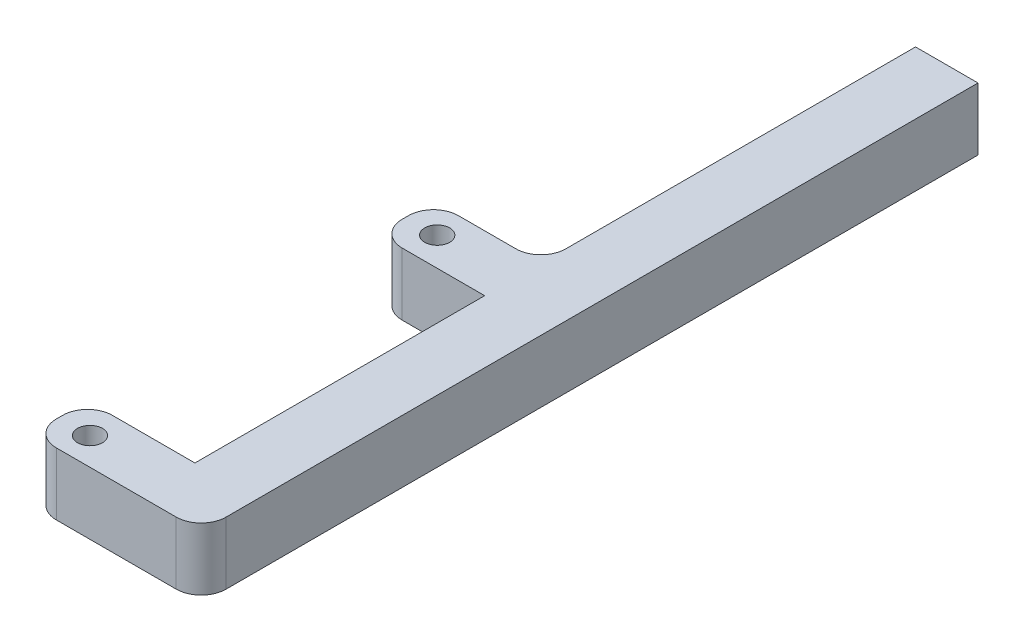
ISO-10303-21;
HEADER;
FILE_DESCRIPTION(('STEP AP214'),'2;1');
FILE_NAME('part.step','',(''),(''),'','','');
FILE_SCHEMA(('AUTOMOTIVE_DESIGN { 1 0 10303 214 1 1 1 1 }'));
ENDSEC;
DATA;
#1=APPLICATION_CONTEXT('core data for automotive mechanical design processes');
#2=APPLICATION_PROTOCOL_DEFINITION('international standard','automotive_design',2000,#1);
#3=PRODUCT_CONTEXT('',#1,'mechanical');
#4=PRODUCT('Part','Part','',(#3));
#5=PRODUCT_RELATED_PRODUCT_CATEGORY('part','',(#4));
#6=PRODUCT_DEFINITION_FORMATION('','',#4);
#7=PRODUCT_DEFINITION_CONTEXT('part definition',#1,'design');
#8=PRODUCT_DEFINITION('design','',#6,#7);
#9=PRODUCT_DEFINITION_SHAPE('','',#8);
#10=(LENGTH_UNIT() NAMED_UNIT(*) SI_UNIT(.MILLI.,.METRE.));
#11=(NAMED_UNIT(*) PLANE_ANGLE_UNIT() SI_UNIT($,.RADIAN.));
#12=(NAMED_UNIT(*) SI_UNIT($,.STERADIAN.) SOLID_ANGLE_UNIT());
#13=UNCERTAINTY_MEASURE_WITH_UNIT(LENGTH_MEASURE(1.E-05),#10,'distance_accuracy_value','');
#14=(GEOMETRIC_REPRESENTATION_CONTEXT(3) GLOBAL_UNCERTAINTY_ASSIGNED_CONTEXT((#13)) GLOBAL_UNIT_ASSIGNED_CONTEXT((#10,
#11,#12)) REPRESENTATION_CONTEXT('',''));
#15=CARTESIAN_POINT('',(0.,0.,0.));
#16=DIRECTION('',(0.,0.,1.));
#17=DIRECTION('',(1.,0.,0.));
#18=AXIS2_PLACEMENT_3D('',#15,#16,#17);
#19=CARTESIAN_POINT('',(0.,5.,0.));
#20=DIRECTION('',(0.,-1.,0.));
#21=DIRECTION('',(0.,0.,-1.));
#22=AXIS2_PLACEMENT_3D('',#19,#20,#21);
#23=PLANE('',#22);
#24=DIRECTION('',(-1.,0.,0.));
#25=VECTOR('',#24,1.);
#26=CARTESIAN_POINT('',(0.,5.,-4.5));
#27=LINE('',#26,#25);
#28=CARTESIAN_POINT('',(8.6,5.,-4.5));
#29=VERTEX_POINT('',#28);
#30=CARTESIAN_POINT('',(2.,5.,-4.5));
#31=VERTEX_POINT('',#30);
#32=EDGE_CURVE('E203',#29,#31,#27,.T.);
#33=ORIENTED_EDGE('',*,*,#32,.T.);
#34=CARTESIAN_POINT('',(2.,5.,-2.5));
#35=DIRECTION('',(0.,-1.,0.));
#36=DIRECTION('',(0.,0.,-1.));
#37=AXIS2_PLACEMENT_3D('',#34,#35,#36);
#38=CIRCLE('',#37,2.);
#39=CARTESIAN_POINT('',(0.,5.,-2.5));
#40=VERTEX_POINT('',#39);
#41=EDGE_CURVE('E286',#31,#40,#38,.F.);
#42=ORIENTED_EDGE('',*,*,#41,.T.);
#43=DIRECTION('',(0.,0.,1.));
#44=VECTOR('',#43,1.);
#45=CARTESIAN_POINT('',(0.,5.,0.));
#46=LINE('',#45,#44);
#47=CARTESIAN_POINT('',(0.,5.,-2.));
#48=VERTEX_POINT('',#47);
#49=EDGE_CURVE('E242',#40,#48,#46,.T.);
#50=ORIENTED_EDGE('',*,*,#49,.T.);
#51=CARTESIAN_POINT('',(2.,5.,-2.));
#52=DIRECTION('',(0.,-1.,0.));
#53=DIRECTION('',(0.,0.,-1.));
#54=AXIS2_PLACEMENT_3D('',#51,#52,#53);
#55=CIRCLE('',#54,2.);
#56=CARTESIAN_POINT('',(2.,5.,0.));
#57=VERTEX_POINT('',#56);
#58=EDGE_CURVE('E281',#48,#57,#55,.F.);
#59=ORIENTED_EDGE('',*,*,#58,.T.);
#60=DIRECTION('',(1.,0.,0.));
#61=VECTOR('',#60,1.);
#62=CARTESIAN_POINT('',(0.,5.,0.));
#63=LINE('',#62,#61);
#64=CARTESIAN_POINT('',(11.6,5.,0.));
#65=VERTEX_POINT('',#64);
#66=EDGE_CURVE('E167',#57,#65,#63,.T.);
#67=ORIENTED_EDGE('',*,*,#66,.T.);
#68=CARTESIAN_POINT('',(11.6,5.,-2.));
#69=DIRECTION('',(0.,-1.,0.));
#70=DIRECTION('',(0.,0.,-1.));
#71=AXIS2_PLACEMENT_3D('',#68,#69,#70);
#72=CIRCLE('',#71,2.);
#73=CARTESIAN_POINT('',(13.6,5.,-2.));
#74=VERTEX_POINT('',#73);
#75=EDGE_CURVE('E162',#65,#74,#72,.F.);
#76=ORIENTED_EDGE('',*,*,#75,.T.);
#77=DIRECTION('',(0.,0.,-1.));
#78=VECTOR('',#77,1.);
#79=CARTESIAN_POINT('',(13.6,5.,0.));
#80=LINE('',#79,#78);
#81=CARTESIAN_POINT('',(13.6,5.,-62.2));
#82=VERTEX_POINT('',#81);
#83=EDGE_CURVE('E152',#74,#82,#80,.T.);
#84=ORIENTED_EDGE('',*,*,#83,.T.);
#85=DIRECTION('',(-1.,0.,0.));
#86=VECTOR('',#85,1.);
#87=CARTESIAN_POINT('',(8.6,5.,-62.2));
#88=LINE('',#87,#86);
#89=CARTESIAN_POINT('',(8.6,5.,-62.2));
#90=VERTEX_POINT('',#89);
#91=EDGE_CURVE('E158',#82,#90,#88,.T.);
#92=ORIENTED_EDGE('',*,*,#91,.T.);
#93=DIRECTION('',(0.,0.,1.));
#94=VECTOR('',#93,1.);
#95=CARTESIAN_POINT('',(8.6,5.,-32.2));
#96=LINE('',#95,#94);
#97=CARTESIAN_POINT('',(8.6,5.,-34.2));
#98=VERTEX_POINT('',#97);
#99=EDGE_CURVE('E184',#90,#98,#96,.T.);
#100=ORIENTED_EDGE('',*,*,#99,.T.);
#101=CARTESIAN_POINT('',(6.6,5.,-34.2));
#102=DIRECTION('',(0.,-1.,0.));
#103=DIRECTION('',(0.,0.,-1.));
#104=AXIS2_PLACEMENT_3D('',#101,#102,#103);
#105=CIRCLE('',#104,2.);
#106=CARTESIAN_POINT('',(6.6,5.,-32.2));
#107=VERTEX_POINT('',#106);
#108=EDGE_CURVE('E11',#98,#107,#105,.T.);
#109=ORIENTED_EDGE('',*,*,#108,.T.);
#110=DIRECTION('',(-1.,0.,0.));
#111=VECTOR('',#110,1.);
#112=CARTESIAN_POINT('',(0.,5.,-32.2));
#113=LINE('',#112,#111);
#114=CARTESIAN_POINT('',(2.,5.,-32.2));
#115=VERTEX_POINT('',#114);
#116=EDGE_CURVE('E187',#107,#115,#113,.T.);
#117=ORIENTED_EDGE('',*,*,#116,.T.);
#118=CARTESIAN_POINT('',(2.,5.,-30.2));
#119=DIRECTION('',(0.,-1.,0.));
#120=DIRECTION('',(0.,0.,-1.));
#121=AXIS2_PLACEMENT_3D('',#118,#119,#120);
#122=CIRCLE('',#121,2.);
#123=CARTESIAN_POINT('',(0.,5.,-30.2));
#124=VERTEX_POINT('',#123);
#125=EDGE_CURVE('E278',#115,#124,#122,.F.);
#126=ORIENTED_EDGE('',*,*,#125,.T.);
#127=DIRECTION('',(0.,0.,1.));
#128=VECTOR('',#127,1.);
#129=CARTESIAN_POINT('',(0.,5.,-27.7));
#130=LINE('',#129,#128);
#131=CARTESIAN_POINT('',(0.,5.,-29.7));
#132=VERTEX_POINT('',#131);
#133=EDGE_CURVE('E194',#124,#132,#130,.T.);
#134=ORIENTED_EDGE('',*,*,#133,.T.);
#135=CARTESIAN_POINT('',(2.,5.,-29.7));
#136=DIRECTION('',(0.,-1.,0.));
#137=DIRECTION('',(0.,0.,-1.));
#138=AXIS2_PLACEMENT_3D('',#135,#136,#137);
#139=CIRCLE('',#138,2.);
#140=CARTESIAN_POINT('',(2.,5.,-27.7));
#141=VERTEX_POINT('',#140);
#142=EDGE_CURVE('E55',#132,#141,#139,.F.);
#143=ORIENTED_EDGE('',*,*,#142,.T.);
#144=DIRECTION('',(1.,0.,0.));
#145=VECTOR('',#144,1.);
#146=CARTESIAN_POINT('',(0.,5.,-27.7));
#147=LINE('',#146,#145);
#148=CARTESIAN_POINT('',(8.6,5.,-27.7));
#149=VERTEX_POINT('',#148);
#150=EDGE_CURVE('E197',#141,#149,#147,.T.);
#151=ORIENTED_EDGE('',*,*,#150,.T.);
#152=DIRECTION('',(0.,0.,1.));
#153=VECTOR('',#152,1.);
#154=CARTESIAN_POINT('',(8.6,5.,-4.5));
#155=LINE('',#154,#153);
#156=EDGE_CURVE('E200',#149,#29,#155,.T.);
#157=ORIENTED_EDGE('',*,*,#156,.T.);
#158=EDGE_LOOP('',(#33,#42,#50,#59,#67,#76,#84,#92,#100,#109,#117,#126,#134,#143,#151,#157));
#159=FACE_BOUND('',#158,.T.);
#160=CARTESIAN_POINT('',(2.5,5.,-2.2));
#161=DIRECTION('',(0.,1.,0.));
#162=DIRECTION('',(0.,0.,1.));
#163=AXIS2_PLACEMENT_3D('',#160,#161,#162);
#164=CIRCLE('',#163,1.);
#165=CARTESIAN_POINT('',(2.5,5.,-1.2));
#166=VERTEX_POINT('',#165);
#167=EDGE_CURVE('E212',#166,#166,#164,.T.);
#168=ORIENTED_EDGE('',*,*,#167,.F.);
#169=EDGE_LOOP('',(#168));
#170=FACE_BOUND('',#169,.T.);
#171=CARTESIAN_POINT('',(2.5,5.,-30.));
#172=DIRECTION('',(0.,1.,0.));
#173=DIRECTION('',(0.,0.,1.));
#174=AXIS2_PLACEMENT_3D('',#171,#172,#173);
#175=CIRCLE('',#174,1.);
#176=CARTESIAN_POINT('',(2.5,5.,-29.));
#177=VERTEX_POINT('',#176);
#178=EDGE_CURVE('E376',#177,#177,#175,.T.);
#179=ORIENTED_EDGE('',*,*,#178,.F.);
#180=EDGE_LOOP('',(#179));
#181=FACE_BOUND('',#180,.T.);
#182=ADVANCED_FACE('F39',(#159,#170,#181),#23,.F.);
#183=CARTESIAN_POINT('',(0.,0.,0.));
#184=DIRECTION('',(0.,-1.,0.));
#185=DIRECTION('',(0.,0.,-1.));
#186=AXIS2_PLACEMENT_3D('',#183,#184,#185);
#187=PLANE('',#186);
#188=CARTESIAN_POINT('',(2.5,0.,-2.2));
#189=DIRECTION('',(0.,1.,0.));
#190=DIRECTION('',(0.,0.,1.));
#191=AXIS2_PLACEMENT_3D('',#188,#189,#190);
#192=CIRCLE('',#191,1.);
#193=CARTESIAN_POINT('',(2.5,0.,-1.2));
#194=VERTEX_POINT('',#193);
#195=EDGE_CURVE('E372',#194,#194,#192,.T.);
#196=ORIENTED_EDGE('',*,*,#195,.T.);
#197=EDGE_LOOP('',(#196));
#198=FACE_BOUND('',#197,.T.);
#199=DIRECTION('',(0.,0.,1.));
#200=VECTOR('',#199,1.);
#201=CARTESIAN_POINT('',(0.,0.,0.));
#202=LINE('',#201,#200);
#203=CARTESIAN_POINT('',(0.,0.,-2.5));
#204=VERTEX_POINT('',#203);
#205=CARTESIAN_POINT('',(0.,0.,-2.));
#206=VERTEX_POINT('',#205);
#207=EDGE_CURVE('E207',#204,#206,#202,.T.);
#208=ORIENTED_EDGE('',*,*,#207,.F.);
#209=CARTESIAN_POINT('',(2.,0.,-2.5));
#210=DIRECTION('',(0.,-1.,0.));
#211=DIRECTION('',(0.,0.,-1.));
#212=AXIS2_PLACEMENT_3D('',#209,#210,#211);
#213=CIRCLE('',#212,2.);
#214=CARTESIAN_POINT('',(2.,0.,-4.5));
#215=VERTEX_POINT('',#214);
#216=EDGE_CURVE('E270',#204,#215,#213,.T.);
#217=ORIENTED_EDGE('',*,*,#216,.T.);
#218=DIRECTION('',(-1.,0.,0.));
#219=VECTOR('',#218,1.);
#220=CARTESIAN_POINT('',(0.,0.,-4.5));
#221=LINE('',#220,#219);
#222=CARTESIAN_POINT('',(8.6,0.,-4.5));
#223=VERTEX_POINT('',#222);
#224=EDGE_CURVE('E238',#223,#215,#221,.T.);
#225=ORIENTED_EDGE('',*,*,#224,.F.);
#226=DIRECTION('',(0.,0.,1.));
#227=VECTOR('',#226,1.);
#228=CARTESIAN_POINT('',(8.6,0.,-4.5));
#229=LINE('',#228,#227);
#230=CARTESIAN_POINT('',(8.6,0.,-27.7));
#231=VERTEX_POINT('',#230);
#232=EDGE_CURVE('E235',#231,#223,#229,.T.);
#233=ORIENTED_EDGE('',*,*,#232,.F.);
#234=DIRECTION('',(1.,0.,0.));
#235=VECTOR('',#234,1.);
#236=CARTESIAN_POINT('',(0.,0.,-27.7));
#237=LINE('',#236,#235);
#238=CARTESIAN_POINT('',(2.,0.,-27.7));
#239=VERTEX_POINT('',#238);
#240=EDGE_CURVE('E232',#239,#231,#237,.T.);
#241=ORIENTED_EDGE('',*,*,#240,.F.);
#242=CARTESIAN_POINT('',(2.,0.,-29.7));
#243=DIRECTION('',(0.,-1.,0.));
#244=DIRECTION('',(0.,0.,-1.));
#245=AXIS2_PLACEMENT_3D('',#242,#243,#244);
#246=CIRCLE('',#245,2.);
#247=CARTESIAN_POINT('',(0.,0.,-29.7));
#248=VERTEX_POINT('',#247);
#249=EDGE_CURVE('E258',#239,#248,#246,.T.);
#250=ORIENTED_EDGE('',*,*,#249,.T.);
#251=DIRECTION('',(0.,0.,1.));
#252=VECTOR('',#251,1.);
#253=CARTESIAN_POINT('',(0.,0.,-27.7));
#254=LINE('',#253,#252);
#255=CARTESIAN_POINT('',(0.,0.,-30.2));
#256=VERTEX_POINT('',#255);
#257=EDGE_CURVE('E229',#256,#248,#254,.T.);
#258=ORIENTED_EDGE('',*,*,#257,.F.);
#259=CARTESIAN_POINT('',(2.,0.,-30.2));
#260=DIRECTION('',(0.,-1.,0.));
#261=DIRECTION('',(0.,0.,-1.));
#262=AXIS2_PLACEMENT_3D('',#259,#260,#261);
#263=CIRCLE('',#262,2.);
#264=CARTESIAN_POINT('',(2.,0.,-32.2));
#265=VERTEX_POINT('',#264);
#266=EDGE_CURVE('E261',#256,#265,#263,.T.);
#267=ORIENTED_EDGE('',*,*,#266,.T.);
#268=DIRECTION('',(-1.,0.,0.));
#269=VECTOR('',#268,1.);
#270=CARTESIAN_POINT('',(0.,0.,-32.2));
#271=LINE('',#270,#269);
#272=CARTESIAN_POINT('',(6.6,0.,-32.2));
#273=VERTEX_POINT('',#272);
#274=EDGE_CURVE('E225',#273,#265,#271,.T.);
#275=ORIENTED_EDGE('',*,*,#274,.F.);
#276=CARTESIAN_POINT('',(6.6,0.,-34.2));
#277=DIRECTION('',(0.,-1.,0.));
#278=DIRECTION('',(0.,0.,-1.));
#279=AXIS2_PLACEMENT_3D('',#276,#277,#278);
#280=CIRCLE('',#279,2.);
#281=CARTESIAN_POINT('',(8.6,0.,-34.2));
#282=VERTEX_POINT('',#281);
#283=EDGE_CURVE('E48',#273,#282,#280,.F.);
#284=ORIENTED_EDGE('',*,*,#283,.T.);
#285=DIRECTION('',(0.,0.,1.));
#286=VECTOR('',#285,1.);
#287=CARTESIAN_POINT('',(8.6,0.,-32.2));
#288=LINE('',#287,#286);
#289=CARTESIAN_POINT('',(8.6,0.,-62.2));
#290=VERTEX_POINT('',#289);
#291=EDGE_CURVE('E221',#290,#282,#288,.T.);
#292=ORIENTED_EDGE('',*,*,#291,.F.);
#293=DIRECTION('',(-1.,0.,0.));
#294=VECTOR('',#293,1.);
#295=CARTESIAN_POINT('',(8.6,0.,-62.2));
#296=LINE('',#295,#294);
#297=CARTESIAN_POINT('',(13.6,0.,-62.2));
#298=VERTEX_POINT('',#297);
#299=EDGE_CURVE('E218',#298,#290,#296,.T.);
#300=ORIENTED_EDGE('',*,*,#299,.F.);
#301=DIRECTION('',(0.,0.,-1.));
#302=VECTOR('',#301,1.);
#303=CARTESIAN_POINT('',(13.6,0.,0.));
#304=LINE('',#303,#302);
#305=CARTESIAN_POINT('',(13.6,0.,-2.));
#306=VERTEX_POINT('',#305);
#307=EDGE_CURVE('E173',#306,#298,#304,.T.);
#308=ORIENTED_EDGE('',*,*,#307,.F.);
#309=CARTESIAN_POINT('',(11.6,0.,-2.));
#310=DIRECTION('',(0.,-1.,0.));
#311=DIRECTION('',(0.,0.,-1.));
#312=AXIS2_PLACEMENT_3D('',#309,#310,#311);
#313=CIRCLE('',#312,2.);
#314=CARTESIAN_POINT('',(11.6,0.,0.));
#315=VERTEX_POINT('',#314);
#316=EDGE_CURVE('E267',#306,#315,#313,.T.);
#317=ORIENTED_EDGE('',*,*,#316,.T.);
#318=DIRECTION('',(1.,0.,0.));
#319=VECTOR('',#318,1.);
#320=CARTESIAN_POINT('',(0.,0.,0.));
#321=LINE('',#320,#319);
#322=CARTESIAN_POINT('',(2.,0.,0.));
#323=VERTEX_POINT('',#322);
#324=EDGE_CURVE('E211',#323,#315,#321,.T.);
#325=ORIENTED_EDGE('',*,*,#324,.F.);
#326=CARTESIAN_POINT('',(2.,0.,-2.));
#327=DIRECTION('',(0.,-1.,0.));
#328=DIRECTION('',(0.,0.,-1.));
#329=AXIS2_PLACEMENT_3D('',#326,#327,#328);
#330=CIRCLE('',#329,2.);
#331=EDGE_CURVE('E264',#323,#206,#330,.T.);
#332=ORIENTED_EDGE('',*,*,#331,.T.);
#333=EDGE_LOOP('',(#208,#217,#225,#233,#241,#250,#258,#267,#275,#284,#292,#300,#308,#317,#325,#332));
#334=FACE_BOUND('',#333,.T.);
#335=CARTESIAN_POINT('',(2.5,0.,-30.));
#336=DIRECTION('',(0.,1.,0.));
#337=DIRECTION('',(0.,0.,1.));
#338=AXIS2_PLACEMENT_3D('',#335,#336,#337);
#339=CIRCLE('',#338,1.);
#340=CARTESIAN_POINT('',(2.5,0.,-29.));
#341=VERTEX_POINT('',#340);
#342=EDGE_CURVE('E380',#341,#341,#339,.T.);
#343=ORIENTED_EDGE('',*,*,#342,.T.);
#344=EDGE_LOOP('',(#343));
#345=FACE_BOUND('',#344,.T.);
#346=ADVANCED_FACE('F323',(#198,#334,#345),#187,.T.);
#347=CARTESIAN_POINT('',(0.,5.,0.));
#348=DIRECTION('',(1.,0.,0.));
#349=DIRECTION('',(0.,0.,-1.));
#350=AXIS2_PLACEMENT_3D('',#347,#348,#349);
#351=PLANE('',#350);
#352=ORIENTED_EDGE('',*,*,#49,.F.);
#353=DIRECTION('',(0.,-1.,0.));
#354=VECTOR('',#353,1.);
#355=CARTESIAN_POINT('',(0.,5.,-2.5));
#356=LINE('',#355,#354);
#357=EDGE_CURVE('E254',#40,#204,#356,.T.);
#358=ORIENTED_EDGE('',*,*,#357,.T.);
#359=ORIENTED_EDGE('',*,*,#207,.T.);
#360=DIRECTION('',(0.,-1.,0.));
#361=VECTOR('',#360,1.);
#362=CARTESIAN_POINT('',(0.,5.,-2.));
#363=LINE('',#362,#361);
#364=EDGE_CURVE('E177',#206,#48,#363,.F.);
#365=ORIENTED_EDGE('',*,*,#364,.T.);
#366=EDGE_LOOP('',(#352,#358,#359,#365));
#367=FACE_BOUND('',#366,.T.);
#368=ADVANCED_FACE('F366',(#367),#351,.F.);
#369=CARTESIAN_POINT('',(0.,5.,0.));
#370=DIRECTION('',(0.,0.,-1.));
#371=DIRECTION('',(-1.,0.,0.));
#372=AXIS2_PLACEMENT_3D('',#369,#370,#371);
#373=PLANE('',#372);
#374=ORIENTED_EDGE('',*,*,#324,.T.);
#375=DIRECTION('',(0.,-1.,0.));
#376=VECTOR('',#375,1.);
#377=CARTESIAN_POINT('',(11.6,5.,0.));
#378=LINE('',#377,#376);
#379=EDGE_CURVE('E296',#315,#65,#378,.F.);
#380=ORIENTED_EDGE('',*,*,#379,.T.);
#381=ORIENTED_EDGE('',*,*,#66,.F.);
#382=DIRECTION('',(0.,-1.,0.));
#383=VECTOR('',#382,1.);
#384=CARTESIAN_POINT('',(2.,5.,0.));
#385=LINE('',#384,#383);
#386=EDGE_CURVE('E292',#57,#323,#385,.T.);
#387=ORIENTED_EDGE('',*,*,#386,.T.);
#388=EDGE_LOOP('',(#374,#380,#381,#387));
#389=FACE_BOUND('',#388,.T.);
#390=ADVANCED_FACE('F418',(#389),#373,.F.);
#391=CARTESIAN_POINT('',(13.6,5.,0.));
#392=DIRECTION('',(-1.,0.,0.));
#393=DIRECTION('',(0.,0.,1.));
#394=AXIS2_PLACEMENT_3D('',#391,#392,#393);
#395=PLANE('',#394);
#396=ORIENTED_EDGE('',*,*,#83,.F.);
#397=DIRECTION('',(0.,-1.,0.));
#398=VECTOR('',#397,1.);
#399=CARTESIAN_POINT('',(13.6,5.,-2.));
#400=LINE('',#399,#398);
#401=EDGE_CURVE('E289',#74,#306,#400,.T.);
#402=ORIENTED_EDGE('',*,*,#401,.T.);
#403=ORIENTED_EDGE('',*,*,#307,.T.);
#404=DIRECTION('',(0.,-1.,0.));
#405=VECTOR('',#404,1.);
#406=CARTESIAN_POINT('',(13.6,5.,-62.2));
#407=LINE('',#406,#405);
#408=EDGE_CURVE('E170',#82,#298,#407,.T.);
#409=ORIENTED_EDGE('',*,*,#408,.F.);
#410=EDGE_LOOP('',(#396,#402,#403,#409));
#411=FACE_BOUND('',#410,.T.);
#412=ADVANCED_FACE('F171',(#411),#395,.F.);
#413=CARTESIAN_POINT('',(8.6,5.,-62.2));
#414=DIRECTION('',(0.,0.,1.));
#415=DIRECTION('',(1.,0.,0.));
#416=AXIS2_PLACEMENT_3D('',#413,#414,#415);
#417=PLANE('',#416);
#418=ORIENTED_EDGE('',*,*,#299,.T.);
#419=DIRECTION('',(0.,-1.,0.));
#420=VECTOR('',#419,1.);
#421=CARTESIAN_POINT('',(8.6,5.,-62.2));
#422=LINE('',#421,#420);
#423=EDGE_CURVE('E178',#90,#290,#422,.T.);
#424=ORIENTED_EDGE('',*,*,#423,.F.);
#425=ORIENTED_EDGE('',*,*,#91,.F.);
#426=ORIENTED_EDGE('',*,*,#408,.T.);
#427=EDGE_LOOP('',(#418,#424,#425,#426));
#428=FACE_BOUND('',#427,.T.);
#429=ADVANCED_FACE('F180',(#428),#417,.F.);
#430=CARTESIAN_POINT('',(8.6,5.,-32.2));
#431=DIRECTION('',(1.,0.,0.));
#432=DIRECTION('',(0.,0.,-1.));
#433=AXIS2_PLACEMENT_3D('',#430,#431,#432);
#434=PLANE('',#433);
#435=ORIENTED_EDGE('',*,*,#291,.T.);
#436=DIRECTION('',(0.,-1.,0.));
#437=VECTOR('',#436,1.);
#438=CARTESIAN_POINT('',(8.6,5.,-34.2));
#439=LINE('',#438,#437);
#440=EDGE_CURVE('E306',#282,#98,#439,.F.);
#441=ORIENTED_EDGE('',*,*,#440,.T.);
#442=ORIENTED_EDGE('',*,*,#99,.F.);
#443=ORIENTED_EDGE('',*,*,#423,.T.);
#444=EDGE_LOOP('',(#435,#441,#442,#443));
#445=FACE_BOUND('',#444,.T.);
#446=ADVANCED_FACE('F329',(#445),#434,.F.);
#447=CARTESIAN_POINT('',(0.,5.,-32.2));
#448=DIRECTION('',(0.,0.,1.));
#449=DIRECTION('',(1.,0.,0.));
#450=AXIS2_PLACEMENT_3D('',#447,#448,#449);
#451=PLANE('',#450);
#452=ORIENTED_EDGE('',*,*,#116,.F.);
#453=DIRECTION('',(0.,-1.,0.));
#454=VECTOR('',#453,1.);
#455=CARTESIAN_POINT('',(6.6,0.,-32.2));
#456=LINE('',#455,#454);
#457=EDGE_CURVE('E302',#107,#273,#456,.T.);
#458=ORIENTED_EDGE('',*,*,#457,.T.);
#459=ORIENTED_EDGE('',*,*,#274,.T.);
#460=DIRECTION('',(0.,-1.,0.));
#461=VECTOR('',#460,1.);
#462=CARTESIAN_POINT('',(2.,5.,-32.2));
#463=LINE('',#462,#461);
#464=EDGE_CURVE('E299',#265,#115,#463,.F.);
#465=ORIENTED_EDGE('',*,*,#464,.T.);
#466=EDGE_LOOP('',(#452,#458,#459,#465));
#467=FACE_BOUND('',#466,.T.);
#468=ADVANCED_FACE('F335',(#467),#451,.F.);
#469=CARTESIAN_POINT('',(0.,5.,-27.7));
#470=DIRECTION('',(1.,0.,0.));
#471=DIRECTION('',(0.,0.,-1.));
#472=AXIS2_PLACEMENT_3D('',#469,#470,#471);
#473=PLANE('',#472);
#474=ORIENTED_EDGE('',*,*,#133,.F.);
#475=DIRECTION('',(0.,-1.,0.));
#476=VECTOR('',#475,1.);
#477=CARTESIAN_POINT('',(0.,5.,-30.2));
#478=LINE('',#477,#476);
#479=EDGE_CURVE('E311',#124,#256,#478,.T.);
#480=ORIENTED_EDGE('',*,*,#479,.T.);
#481=ORIENTED_EDGE('',*,*,#257,.T.);
#482=DIRECTION('',(0.,-1.,0.));
#483=VECTOR('',#482,1.);
#484=CARTESIAN_POINT('',(0.,5.,-29.7));
#485=LINE('',#484,#483);
#486=EDGE_CURVE('E63',#248,#132,#485,.F.);
#487=ORIENTED_EDGE('',*,*,#486,.T.);
#488=EDGE_LOOP('',(#474,#480,#481,#487));
#489=FACE_BOUND('',#488,.T.);
#490=ADVANCED_FACE('F340',(#489),#473,.F.);
#491=CARTESIAN_POINT('',(0.,5.,-27.7));
#492=DIRECTION('',(0.,0.,-1.));
#493=DIRECTION('',(-1.,0.,0.));
#494=AXIS2_PLACEMENT_3D('',#491,#492,#493);
#495=PLANE('',#494);
#496=ORIENTED_EDGE('',*,*,#150,.F.);
#497=DIRECTION('',(0.,-1.,0.));
#498=VECTOR('',#497,1.);
#499=CARTESIAN_POINT('',(2.,5.,-27.7));
#500=LINE('',#499,#498);
#501=EDGE_CURVE('E315',#141,#239,#500,.T.);
#502=ORIENTED_EDGE('',*,*,#501,.T.);
#503=ORIENTED_EDGE('',*,*,#240,.T.);
#504=DIRECTION('',(0.,-1.,0.));
#505=VECTOR('',#504,1.);
#506=CARTESIAN_POINT('',(8.6,5.,-27.7));
#507=LINE('',#506,#505);
#508=EDGE_CURVE('E246',#149,#231,#507,.T.);
#509=ORIENTED_EDGE('',*,*,#508,.F.);
#510=EDGE_LOOP('',(#496,#502,#503,#509));
#511=FACE_BOUND('',#510,.T.);
#512=ADVANCED_FACE('F347',(#511),#495,.F.);
#513=CARTESIAN_POINT('',(8.6,5.,-4.5));
#514=DIRECTION('',(1.,0.,0.));
#515=DIRECTION('',(0.,0.,-1.));
#516=AXIS2_PLACEMENT_3D('',#513,#514,#515);
#517=PLANE('',#516);
#518=ORIENTED_EDGE('',*,*,#232,.T.);
#519=DIRECTION('',(0.,-1.,0.));
#520=VECTOR('',#519,1.);
#521=CARTESIAN_POINT('',(8.6,5.,-4.5));
#522=LINE('',#521,#520);
#523=EDGE_CURVE('E206',#29,#223,#522,.T.);
#524=ORIENTED_EDGE('',*,*,#523,.F.);
#525=ORIENTED_EDGE('',*,*,#156,.F.);
#526=ORIENTED_EDGE('',*,*,#508,.T.);
#527=EDGE_LOOP('',(#518,#524,#525,#526));
#528=FACE_BOUND('',#527,.T.);
#529=ADVANCED_FACE('F354',(#528),#517,.F.);
#530=CARTESIAN_POINT('',(0.,5.,-4.5));
#531=DIRECTION('',(0.,0.,1.));
#532=DIRECTION('',(1.,0.,0.));
#533=AXIS2_PLACEMENT_3D('',#530,#531,#532);
#534=PLANE('',#533);
#535=ORIENTED_EDGE('',*,*,#224,.T.);
#536=DIRECTION('',(0.,-1.,0.));
#537=VECTOR('',#536,1.);
#538=CARTESIAN_POINT('',(2.,5.,-4.5));
#539=LINE('',#538,#537);
#540=EDGE_CURVE('E273',#215,#31,#539,.F.);
#541=ORIENTED_EDGE('',*,*,#540,.T.);
#542=ORIENTED_EDGE('',*,*,#32,.F.);
#543=ORIENTED_EDGE('',*,*,#523,.T.);
#544=EDGE_LOOP('',(#535,#541,#542,#543));
#545=FACE_BOUND('',#544,.T.);
#546=ADVANCED_FACE('F357',(#545),#534,.F.);
#547=CARTESIAN_POINT('',(2.5,5.,-2.2));
#548=DIRECTION('',(0.,-1.,0.));
#549=DIRECTION('',(0.,0.,-1.));
#550=AXIS2_PLACEMENT_3D('',#547,#548,#549);
#551=CYLINDRICAL_SURFACE('',#550,1.);
#552=ORIENTED_EDGE('',*,*,#167,.T.);
#553=EDGE_LOOP('',(#552));
#554=FACE_BOUND('',#553,.T.);
#555=ORIENTED_EDGE('',*,*,#195,.F.);
#556=EDGE_LOOP('',(#555));
#557=FACE_BOUND('',#556,.T.);
#558=ADVANCED_FACE('F399',(#554,#557),#551,.F.);
#559=CARTESIAN_POINT('',(2.5,5.,-30.));
#560=DIRECTION('',(0.,-1.,0.));
#561=DIRECTION('',(0.,0.,-1.));
#562=AXIS2_PLACEMENT_3D('',#559,#560,#561);
#563=CYLINDRICAL_SURFACE('',#562,1.);
#564=ORIENTED_EDGE('',*,*,#178,.T.);
#565=EDGE_LOOP('',(#564));
#566=FACE_BOUND('',#565,.T.);
#567=ORIENTED_EDGE('',*,*,#342,.F.);
#568=EDGE_LOOP('',(#567));
#569=FACE_BOUND('',#568,.T.);
#570=ADVANCED_FACE('F388',(#566,#569),#563,.F.);
#571=CARTESIAN_POINT('',(2.,5.,-2.5));
#572=DIRECTION('',(0.,-1.,0.));
#573=DIRECTION('',(0.,0.,-1.));
#574=AXIS2_PLACEMENT_3D('',#571,#572,#573);
#575=CYLINDRICAL_SURFACE('',#574,2.);
#576=ORIENTED_EDGE('',*,*,#41,.F.);
#577=ORIENTED_EDGE('',*,*,#540,.F.);
#578=ORIENTED_EDGE('',*,*,#216,.F.);
#579=ORIENTED_EDGE('',*,*,#357,.F.);
#580=EDGE_LOOP('',(#576,#577,#578,#579));
#581=FACE_BOUND('',#580,.T.);
#582=ADVANCED_FACE('F360',(#581),#575,.T.);
#583=CARTESIAN_POINT('',(11.6,5.,-2.));
#584=DIRECTION('',(0.,-1.,0.));
#585=DIRECTION('',(0.,0.,-1.));
#586=AXIS2_PLACEMENT_3D('',#583,#584,#585);
#587=CYLINDRICAL_SURFACE('',#586,2.);
#588=ORIENTED_EDGE('',*,*,#75,.F.);
#589=ORIENTED_EDGE('',*,*,#379,.F.);
#590=ORIENTED_EDGE('',*,*,#316,.F.);
#591=ORIENTED_EDGE('',*,*,#401,.F.);
#592=EDGE_LOOP('',(#588,#589,#590,#591));
#593=FACE_BOUND('',#592,.T.);
#594=ADVANCED_FACE('F426',(#593),#587,.T.);
#595=CARTESIAN_POINT('',(6.6,5.,-34.2));
#596=DIRECTION('',(0.,1.,0.));
#597=DIRECTION('',(0.,0.,1.));
#598=AXIS2_PLACEMENT_3D('',#595,#596,#597);
#599=CYLINDRICAL_SURFACE('',#598,2.);
#600=ORIENTED_EDGE('',*,*,#108,.F.);
#601=ORIENTED_EDGE('',*,*,#440,.F.);
#602=ORIENTED_EDGE('',*,*,#283,.F.);
#603=ORIENTED_EDGE('',*,*,#457,.F.);
#604=EDGE_LOOP('',(#600,#601,#602,#603));
#605=FACE_BOUND('',#604,.T.);
#606=ADVANCED_FACE('F331',(#605),#599,.F.);
#607=CARTESIAN_POINT('',(2.,5.,-2.));
#608=DIRECTION('',(0.,-1.,0.));
#609=DIRECTION('',(0.,0.,-1.));
#610=AXIS2_PLACEMENT_3D('',#607,#608,#609);
#611=CYLINDRICAL_SURFACE('',#610,2.);
#612=ORIENTED_EDGE('',*,*,#58,.F.);
#613=ORIENTED_EDGE('',*,*,#364,.F.);
#614=ORIENTED_EDGE('',*,*,#331,.F.);
#615=ORIENTED_EDGE('',*,*,#386,.F.);
#616=EDGE_LOOP('',(#612,#613,#614,#615));
#617=FACE_BOUND('',#616,.T.);
#618=ADVANCED_FACE('F432',(#617),#611,.T.);
#619=CARTESIAN_POINT('',(2.,5.,-30.2));
#620=DIRECTION('',(0.,-1.,0.));
#621=DIRECTION('',(0.,0.,-1.));
#622=AXIS2_PLACEMENT_3D('',#619,#620,#621);
#623=CYLINDRICAL_SURFACE('',#622,2.);
#624=ORIENTED_EDGE('',*,*,#125,.F.);
#625=ORIENTED_EDGE('',*,*,#464,.F.);
#626=ORIENTED_EDGE('',*,*,#266,.F.);
#627=ORIENTED_EDGE('',*,*,#479,.F.);
#628=EDGE_LOOP('',(#624,#625,#626,#627));
#629=FACE_BOUND('',#628,.T.);
#630=ADVANCED_FACE('F338',(#629),#623,.T.);
#631=CARTESIAN_POINT('',(2.,5.,-29.7));
#632=DIRECTION('',(0.,-1.,0.));
#633=DIRECTION('',(0.,0.,-1.));
#634=AXIS2_PLACEMENT_3D('',#631,#632,#633);
#635=CYLINDRICAL_SURFACE('',#634,2.);
#636=ORIENTED_EDGE('',*,*,#142,.F.);
#637=ORIENTED_EDGE('',*,*,#486,.F.);
#638=ORIENTED_EDGE('',*,*,#249,.F.);
#639=ORIENTED_EDGE('',*,*,#501,.F.);
#640=EDGE_LOOP('',(#636,#637,#638,#639));
#641=FACE_BOUND('',#640,.T.);
#642=ADVANCED_FACE('F41',(#641),#635,.T.);
#643=CLOSED_SHELL('',(#182,#346,#368,#390,#412,#429,#446,#468,#490,#512,#529,#546,#558,#570,
#582,#594,#606,#618,#630,#642));
#644=MANIFOLD_SOLID_BREP('B2',#643);
#645=ADVANCED_BREP_SHAPE_REPRESENTATION('',(#18,#644),#14);
#646=SHAPE_DEFINITION_REPRESENTATION(#9,#645);
ENDSEC;
END-ISO-10303-21;
